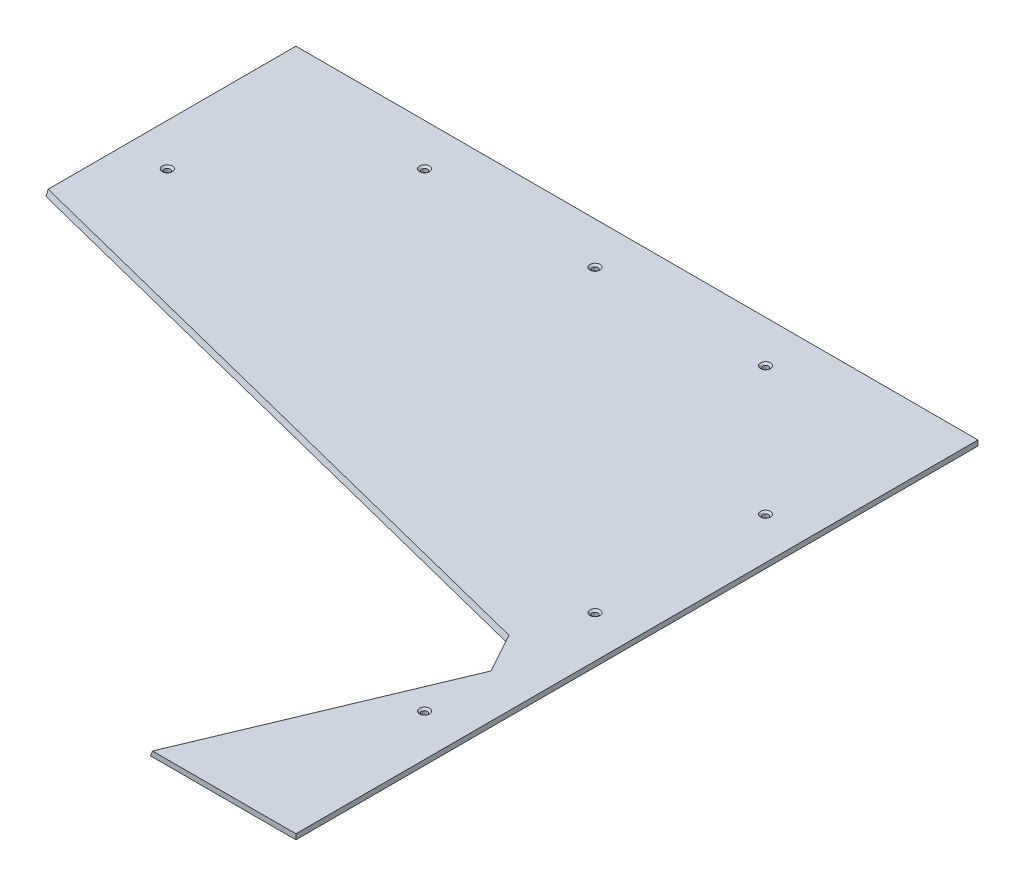
ISO-10303-21;
HEADER;
FILE_DESCRIPTION(('STEP AP214'),'2;1');
FILE_NAME('part.step','',(''),(''),'','','');
FILE_SCHEMA(('AUTOMOTIVE_DESIGN { 1 0 10303 214 1 1 1 1 }'));
ENDSEC;
DATA;
#1=APPLICATION_CONTEXT('core data for automotive mechanical design processes');
#2=APPLICATION_PROTOCOL_DEFINITION('international standard','automotive_design',2000,#1);
#3=PRODUCT_CONTEXT('',#1,'mechanical');
#4=PRODUCT('Part','Part','',(#3));
#5=PRODUCT_RELATED_PRODUCT_CATEGORY('part','',(#4));
#6=PRODUCT_DEFINITION_FORMATION('','',#4);
#7=PRODUCT_DEFINITION_CONTEXT('part definition',#1,'design');
#8=PRODUCT_DEFINITION('design','',#6,#7);
#9=PRODUCT_DEFINITION_SHAPE('','',#8);
#10=(LENGTH_UNIT() NAMED_UNIT(*) SI_UNIT(.MILLI.,.METRE.));
#11=(NAMED_UNIT(*) PLANE_ANGLE_UNIT() SI_UNIT($,.RADIAN.));
#12=(NAMED_UNIT(*) SI_UNIT($,.STERADIAN.) SOLID_ANGLE_UNIT());
#13=UNCERTAINTY_MEASURE_WITH_UNIT(LENGTH_MEASURE(1.E-05),#10,'distance_accuracy_value','');
#14=(GEOMETRIC_REPRESENTATION_CONTEXT(3) GLOBAL_UNCERTAINTY_ASSIGNED_CONTEXT((#13)) GLOBAL_UNIT_ASSIGNED_CONTEXT((#10,
#11,#12)) REPRESENTATION_CONTEXT('',''));
#15=CARTESIAN_POINT('',(0.,0.,0.));
#16=DIRECTION('',(0.,0.,1.));
#17=DIRECTION('',(1.,0.,0.));
#18=AXIS2_PLACEMENT_3D('',#15,#16,#17);
#19=CARTESIAN_POINT('',(103.375714,114.488214,103.375714));
#20=DIRECTION('',(1.,0.,0.));
#21=DIRECTION('',(0.,0.,1.));
#22=AXIS2_PLACEMENT_3D('',#19,#20,#21);
#23=PLANE('',#22);
#24=DIRECTION('',(0.,0.,1.));
#25=VECTOR('',#24,1.);
#26=CARTESIAN_POINT('',(103.375714,112.900714,103.375714));
#27=LINE('',#26,#25);
#28=CARTESIAN_POINT('',(103.375714,112.900714,-103.375714));
#29=VERTEX_POINT('',#28);
#30=CARTESIAN_POINT('',(103.375714,112.900714,103.375714));
#31=VERTEX_POINT('',#30);
#32=EDGE_CURVE('E188',#29,#31,#27,.T.);
#33=ORIENTED_EDGE('',*,*,#32,.F.);
#34=DIRECTION('',(0.,-1.,0.));
#35=VECTOR('',#34,1.);
#36=CARTESIAN_POINT('',(103.375714,114.488214,-103.375714));
#37=LINE('',#36,#35);
#38=CARTESIAN_POINT('',(103.375714,114.488214,-103.375714));
#39=VERTEX_POINT('',#38);
#40=EDGE_CURVE('E55',#39,#29,#37,.T.);
#41=ORIENTED_EDGE('',*,*,#40,.F.);
#42=DIRECTION('',(0.,0.,1.));
#43=VECTOR('',#42,1.);
#44=CARTESIAN_POINT('',(103.375714,114.488214,103.375714));
#45=LINE('',#44,#43);
#46=CARTESIAN_POINT('',(103.375714,114.488214,103.375714));
#47=VERTEX_POINT('',#46);
#48=EDGE_CURVE('E189',#39,#47,#45,.T.);
#49=ORIENTED_EDGE('',*,*,#48,.T.);
#50=DIRECTION('',(0.,-1.,0.));
#51=VECTOR('',#50,1.);
#52=CARTESIAN_POINT('',(103.375714,114.488214,103.375714));
#53=LINE('',#52,#51);
#54=EDGE_CURVE('E76',#47,#31,#53,.T.);
#55=ORIENTED_EDGE('',*,*,#54,.T.);
#56=EDGE_LOOP('',(#33,#41,#49,#55));
#57=FACE_BOUND('',#56,.T.);
#58=ADVANCED_FACE('F32',(#57),#23,.T.);
#59=CARTESIAN_POINT('',(103.375714,114.488214,-103.375714));
#60=DIRECTION('',(0.,0.,-1.));
#61=DIRECTION('',(1.,0.,0.));
#62=AXIS2_PLACEMENT_3D('',#59,#60,#61);
#63=PLANE('',#62);
#64=DIRECTION('',(1.,0.,0.));
#65=VECTOR('',#64,1.);
#66=CARTESIAN_POINT('',(103.375714,112.900714,-103.375714));
#67=LINE('',#66,#65);
#68=CARTESIAN_POINT('',(-103.375714,112.900714,-103.375714));
#69=VERTEX_POINT('',#68);
#70=EDGE_CURVE('E192',#69,#29,#67,.T.);
#71=ORIENTED_EDGE('',*,*,#70,.F.);
#72=DIRECTION('',(0.,-1.,0.));
#73=VECTOR('',#72,1.);
#74=CARTESIAN_POINT('',(-103.375714,114.488214,-103.375714));
#75=LINE('',#74,#73);
#76=CARTESIAN_POINT('',(-103.375714,114.488214,-103.375714));
#77=VERTEX_POINT('',#76);
#78=EDGE_CURVE('E208',#77,#69,#75,.T.);
#79=ORIENTED_EDGE('',*,*,#78,.F.);
#80=DIRECTION('',(1.,0.,0.));
#81=VECTOR('',#80,1.);
#82=CARTESIAN_POINT('',(103.375714,114.488214,-103.375714));
#83=LINE('',#82,#81);
#84=EDGE_CURVE('E196',#77,#39,#83,.T.);
#85=ORIENTED_EDGE('',*,*,#84,.T.);
#86=ORIENTED_EDGE('',*,*,#40,.T.);
#87=EDGE_LOOP('',(#71,#79,#85,#86));
#88=FACE_BOUND('',#87,.T.);
#89=ADVANCED_FACE('F223',(#88),#63,.T.);
#90=CARTESIAN_POINT('',(-103.375714,114.488214,103.375714));
#91=DIRECTION('',(-1.,0.,0.));
#92=DIRECTION('',(0.,0.,-1.));
#93=AXIS2_PLACEMENT_3D('',#90,#91,#92);
#94=PLANE('',#93);
#95=DIRECTION('',(0.,-0.923214701144147,0.384284550289657));
#96=VECTOR('',#95,1.);
#97=CARTESIAN_POINT('',(-103.375714,67.7777488921293,-8.84266181646749));
#98=LINE('',#97,#96);
#99=CARTESIAN_POINT('',(-103.375714,114.488214,-28.285712339334));
#100=VERTEX_POINT('',#99);
#101=CARTESIAN_POINT('',(-103.375714,112.900714,-27.6249216014604));
#102=VERTEX_POINT('',#101);
#103=EDGE_CURVE('E119',#100,#102,#98,.T.);
#104=ORIENTED_EDGE('',*,*,#103,.F.);
#105=DIRECTION('',(0.,0.,-1.));
#106=VECTOR('',#105,1.);
#107=CARTESIAN_POINT('',(-103.375714,114.488214,103.375714));
#108=LINE('',#107,#106);
#109=EDGE_CURVE('E194',#100,#77,#108,.T.);
#110=ORIENTED_EDGE('',*,*,#109,.T.);
#111=ORIENTED_EDGE('',*,*,#78,.T.);
#112=DIRECTION('',(0.,0.,-1.));
#113=VECTOR('',#112,1.);
#114=CARTESIAN_POINT('',(-103.375714,112.900714,103.375714));
#115=LINE('',#114,#113);
#116=EDGE_CURVE('E203',#102,#69,#115,.T.);
#117=ORIENTED_EDGE('',*,*,#116,.F.);
#118=EDGE_LOOP('',(#104,#110,#111,#117));
#119=FACE_BOUND('',#118,.T.);
#120=ADVANCED_FACE('F220',(#119),#94,.T.);
#121=CARTESIAN_POINT('',(103.375714,114.488214,103.375714));
#122=DIRECTION('',(0.,0.,1.));
#123=DIRECTION('',(-1.,0.,0.));
#124=AXIS2_PLACEMENT_3D('',#121,#122,#123);
#125=PLANE('',#124);
#126=DIRECTION('',(0.370324166908682,0.928902584452961,0.));
#127=VECTOR('',#126,1.);
#128=CARTESIAN_POINT('',(65.8820392216929,129.435759748081,103.375714));
#129=LINE('',#128,#127);
#130=CARTESIAN_POINT('',(59.2900379247417,112.900714,103.375714));
#131=VERTEX_POINT('',#130);
#132=CARTESIAN_POINT('',(59.9229241119556,114.488214,103.375714));
#133=VERTEX_POINT('',#132);
#134=EDGE_CURVE('E104',#131,#133,#129,.T.);
#135=ORIENTED_EDGE('',*,*,#134,.F.);
#136=DIRECTION('',(-1.,0.,0.));
#137=VECTOR('',#136,1.);
#138=CARTESIAN_POINT('',(103.375714,112.900714,103.375714));
#139=LINE('',#138,#137);
#140=EDGE_CURVE('E200',#31,#131,#139,.T.);
#141=ORIENTED_EDGE('',*,*,#140,.F.);
#142=ORIENTED_EDGE('',*,*,#54,.F.);
#143=DIRECTION('',(-1.,0.,0.));
#144=VECTOR('',#143,1.);
#145=CARTESIAN_POINT('',(103.375714,114.488214,103.375714));
#146=LINE('',#145,#144);
#147=EDGE_CURVE('E191',#47,#133,#146,.T.);
#148=ORIENTED_EDGE('',*,*,#147,.T.);
#149=EDGE_LOOP('',(#135,#141,#142,#148));
#150=FACE_BOUND('',#149,.T.);
#151=ADVANCED_FACE('F224',(#150),#125,.T.);
#152=CARTESIAN_POINT('',(103.375714,114.488214,-103.375714));
#153=DIRECTION('',(0.,1.,0.));
#154=DIRECTION('',(0.,0.,-1.));
#155=AXIS2_PLACEMENT_3D('',#152,#153,#154);
#156=PLANE('',#155);
#157=DIRECTION('',(0.386214206739788,0.,-0.922409121004533));
#158=VECTOR('',#157,1.);
#159=CARTESIAN_POINT('',(140.059084456709,114.488214,-88.0163268269303));
#160=LINE('',#159,#158);
#161=CARTESIAN_POINT('',(90.2021731605812,114.488214,31.0587069810483));
#162=VERTEX_POINT('',#161);
#163=EDGE_CURVE('E99',#133,#162,#160,.T.);
#164=ORIENTED_EDGE('',*,*,#163,.F.);
#165=ORIENTED_EDGE('',*,*,#147,.F.);
#166=ORIENTED_EDGE('',*,*,#48,.F.);
#167=ORIENTED_EDGE('',*,*,#84,.F.);
#168=ORIENTED_EDGE('',*,*,#109,.F.);
#169=DIRECTION('',(-0.969510212842494,0.,-0.245050907352128));
#170=VECTOR('',#169,1.);
#171=CARTESIAN_POINT('',(73.1204673287784,114.488214,16.3250084203753));
#172=LINE('',#171,#170);
#173=CARTESIAN_POINT('',(83.5395341980309,114.488214,18.9585049594031));
#174=VERTEX_POINT('',#173);
#175=EDGE_CURVE('E118',#174,#100,#172,.T.);
#176=ORIENTED_EDGE('',*,*,#175,.F.);
#177=DIRECTION('',(-0.482337100584352,0.,-0.875985685613573));
#178=VECTOR('',#177,1.);
#179=CARTESIAN_POINT('',(36.4657005431364,114.488214,-66.533580137689));
#180=LINE('',#179,#178);
#181=EDGE_CURVE('E110',#162,#174,#180,.T.);
#182=ORIENTED_EDGE('',*,*,#181,.F.);
#183=EDGE_LOOP('',(#164,#165,#166,#167,#168,#176,#182));
#184=FACE_BOUND('',#183,.T.);
#185=CARTESIAN_POINT('',(-90.6757139999995,114.488214,-51.687857000001));
#186=DIRECTION('',(0.,1.,0.));
#187=DIRECTION('',(0.,0.,-1.));
#188=AXIS2_PLACEMENT_3D('',#185,#186,#187);
#189=CIRCLE('',#188,1.51129999999999);
#190=CARTESIAN_POINT('',(-90.6757139999995,114.488214,-53.1991570000009));
#191=VERTEX_POINT('',#190);
#192=EDGE_CURVE('E107',#191,#191,#189,.T.);
#193=ORIENTED_EDGE('',*,*,#192,.F.);
#194=EDGE_LOOP('',(#193));
#195=FACE_BOUND('',#194,.T.);
#196=CARTESIAN_POINT('',(90.6757140000002,114.488214,-51.6878569999997));
#197=DIRECTION('',(0.,1.,0.));
#198=DIRECTION('',(0.,0.,-1.));
#199=AXIS2_PLACEMENT_3D('',#196,#197,#198);
#200=CIRCLE('',#199,1.51130000000001);
#201=CARTESIAN_POINT('',(90.6757140000002,114.488214,-53.1991569999997));
#202=VERTEX_POINT('',#201);
#203=EDGE_CURVE('E134',#202,#202,#200,.T.);
#204=ORIENTED_EDGE('',*,*,#203,.F.);
#205=EDGE_LOOP('',(#204));
#206=FACE_BOUND('',#205,.T.);
#207=CARTESIAN_POINT('',(90.675714,114.488214,3.03005275632947E-13));
#208=DIRECTION('',(0.,1.,0.));
#209=DIRECTION('',(0.,0.,-1.));
#210=AXIS2_PLACEMENT_3D('',#207,#208,#209);
#211=CIRCLE('',#210,1.51129999999999);
#212=CARTESIAN_POINT('',(90.675714,114.488214,-1.51129999999969));
#213=VERTEX_POINT('',#212);
#214=EDGE_CURVE('E143',#213,#213,#211,.T.);
#215=ORIENTED_EDGE('',*,*,#214,.F.);
#216=EDGE_LOOP('',(#215));
#217=FACE_BOUND('',#216,.T.);
#218=CARTESIAN_POINT('',(90.6757139999998,114.488214,51.6878570000003));
#219=DIRECTION('',(0.,1.,0.));
#220=DIRECTION('',(0.,0.,-1.));
#221=AXIS2_PLACEMENT_3D('',#218,#219,#220);
#222=CIRCLE('',#221,1.51129999999999);
#223=CARTESIAN_POINT('',(90.6757139999998,114.488214,50.1765570000003));
#224=VERTEX_POINT('',#223);
#225=EDGE_CURVE('E152',#224,#224,#222,.T.);
#226=ORIENTED_EDGE('',*,*,#225,.F.);
#227=EDGE_LOOP('',(#226));
#228=FACE_BOUND('',#227,.T.);
#229=CARTESIAN_POINT('',(-51.687857,114.488214,-90.675714));
#230=DIRECTION('',(0.,1.,0.));
#231=DIRECTION('',(0.,0.,-1.));
#232=AXIS2_PLACEMENT_3D('',#229,#230,#231);
#233=CIRCLE('',#232,1.5113);
#234=CARTESIAN_POINT('',(-51.687857,114.488214,-92.187014));
#235=VERTEX_POINT('',#234);
#236=EDGE_CURVE('E161',#235,#235,#233,.T.);
#237=ORIENTED_EDGE('',*,*,#236,.F.);
#238=EDGE_LOOP('',(#237));
#239=FACE_BOUND('',#238,.T.);
#240=CARTESIAN_POINT('',(0.,114.488214,-90.675714));
#241=DIRECTION('',(0.,1.,0.));
#242=DIRECTION('',(0.,0.,-1.));
#243=AXIS2_PLACEMENT_3D('',#240,#241,#242);
#244=CIRCLE('',#243,1.5113);
#245=CARTESIAN_POINT('',(0.,114.488214,-92.187014));
#246=VERTEX_POINT('',#245);
#247=EDGE_CURVE('E170',#246,#246,#244,.T.);
#248=ORIENTED_EDGE('',*,*,#247,.F.);
#249=EDGE_LOOP('',(#248));
#250=FACE_BOUND('',#249,.T.);
#251=CARTESIAN_POINT('',(51.687857,114.488214,-90.675714));
#252=DIRECTION('',(0.,1.,0.));
#253=DIRECTION('',(0.,0.,-1.));
#254=AXIS2_PLACEMENT_3D('',#251,#252,#253);
#255=CIRCLE('',#254,1.5113);
#256=CARTESIAN_POINT('',(51.687857,114.488214,-92.187014));
#257=VERTEX_POINT('',#256);
#258=EDGE_CURVE('E179',#257,#257,#255,.T.);
#259=ORIENTED_EDGE('',*,*,#258,.F.);
#260=EDGE_LOOP('',(#259));
#261=FACE_BOUND('',#260,.T.);
#262=ADVANCED_FACE('F115',(#184,#195,#206,#217,#228,#239,#250,#261),#156,.T.);
#263=CARTESIAN_POINT('',(103.375714,112.900714,-103.375714));
#264=DIRECTION('',(0.,1.,0.));
#265=DIRECTION('',(0.,0.,-1.));
#266=AXIS2_PLACEMENT_3D('',#263,#264,#265);
#267=PLANE('',#266);
#268=ORIENTED_EDGE('',*,*,#140,.T.);
#269=DIRECTION('',(0.386214206739788,0.,-0.922409121004533));
#270=VECTOR('',#269,1.);
#271=CARTESIAN_POINT('',(139.520600467756,112.900714,-88.2417909533136));
#272=LINE('',#271,#270);
#273=CARTESIAN_POINT('',(91.1661518821163,112.900714,27.2448577462518));
#274=VERTEX_POINT('',#273);
#275=EDGE_CURVE('E11',#131,#274,#272,.T.);
#276=ORIENTED_EDGE('',*,*,#275,.T.);
#277=DIRECTION('',(-0.482337100584352,0.,-0.875985685613573));
#278=VECTOR('',#277,1.);
#279=CARTESIAN_POINT('',(38.8168395913419,112.900714,-67.8281693190039));
#280=LINE('',#279,#278);
#281=CARTESIAN_POINT('',(87.521539653221,112.900714,20.6257771524999));
#282=VERTEX_POINT('',#281);
#283=EDGE_CURVE('E112',#274,#282,#280,.T.);
#284=ORIENTED_EDGE('',*,*,#283,.T.);
#285=DIRECTION('',(-0.969510212842494,0.,-0.245050907352128));
#286=VECTOR('',#285,1.);
#287=CARTESIAN_POINT('',(72.9634770899354,112.900714,16.9461187093333));
#288=LINE('',#287,#286);
#289=EDGE_CURVE('E39',#282,#102,#288,.T.);
#290=ORIENTED_EDGE('',*,*,#289,.T.);
#291=ORIENTED_EDGE('',*,*,#116,.T.);
#292=ORIENTED_EDGE('',*,*,#70,.T.);
#293=ORIENTED_EDGE('',*,*,#32,.T.);
#294=EDGE_LOOP('',(#268,#276,#284,#290,#291,#292,#293));
#295=FACE_BOUND('',#294,.T.);
#296=CARTESIAN_POINT('',(-90.6757139999995,112.900714,-51.687857000001));
#297=DIRECTION('',(0.,1.,0.));
#298=DIRECTION('',(0.,0.,-1.));
#299=AXIS2_PLACEMENT_3D('',#296,#297,#298);
#300=CIRCLE('',#299,0.889000000000001);
#301=CARTESIAN_POINT('',(-90.6757139999995,112.900714,-52.576857000001));
#302=VERTEX_POINT('',#301);
#303=EDGE_CURVE('E131',#302,#302,#300,.T.);
#304=ORIENTED_EDGE('',*,*,#303,.T.);
#305=EDGE_LOOP('',(#304));
#306=FACE_BOUND('',#305,.T.);
#307=CARTESIAN_POINT('',(90.6757140000002,112.900714,-51.6878569999997));
#308=DIRECTION('',(0.,1.,0.));
#309=DIRECTION('',(0.,0.,-1.));
#310=AXIS2_PLACEMENT_3D('',#307,#308,#309);
#311=CIRCLE('',#310,0.889000000000001);
#312=CARTESIAN_POINT('',(90.6757140000002,112.900714,-52.5768569999997));
#313=VERTEX_POINT('',#312);
#314=EDGE_CURVE('E140',#313,#313,#311,.T.);
#315=ORIENTED_EDGE('',*,*,#314,.T.);
#316=EDGE_LOOP('',(#315));
#317=FACE_BOUND('',#316,.T.);
#318=CARTESIAN_POINT('',(90.675714,112.900714,3.03005275632947E-13));
#319=DIRECTION('',(0.,1.,0.));
#320=DIRECTION('',(0.,0.,-1.));
#321=AXIS2_PLACEMENT_3D('',#318,#319,#320);
#322=CIRCLE('',#321,0.889000000000001);
#323=CARTESIAN_POINT('',(90.675714,112.900714,-0.888999999999698));
#324=VERTEX_POINT('',#323);
#325=EDGE_CURVE('E149',#324,#324,#322,.T.);
#326=ORIENTED_EDGE('',*,*,#325,.T.);
#327=EDGE_LOOP('',(#326));
#328=FACE_BOUND('',#327,.T.);
#329=CARTESIAN_POINT('',(90.6757139999998,112.900714,51.6878570000003));
#330=DIRECTION('',(0.,1.,0.));
#331=DIRECTION('',(0.,0.,-1.));
#332=AXIS2_PLACEMENT_3D('',#329,#330,#331);
#333=CIRCLE('',#332,0.889000000000001);
#334=CARTESIAN_POINT('',(90.6757139999998,112.900714,50.7988570000003));
#335=VERTEX_POINT('',#334);
#336=EDGE_CURVE('E158',#335,#335,#333,.T.);
#337=ORIENTED_EDGE('',*,*,#336,.T.);
#338=EDGE_LOOP('',(#337));
#339=FACE_BOUND('',#338,.T.);
#340=CARTESIAN_POINT('',(-51.687857,112.900714,-90.675714));
#341=DIRECTION('',(0.,1.,0.));
#342=DIRECTION('',(0.,0.,-1.));
#343=AXIS2_PLACEMENT_3D('',#340,#341,#342);
#344=CIRCLE('',#343,0.889000000000001);
#345=CARTESIAN_POINT('',(-51.687857,112.900714,-91.564714));
#346=VERTEX_POINT('',#345);
#347=EDGE_CURVE('E167',#346,#346,#344,.T.);
#348=ORIENTED_EDGE('',*,*,#347,.T.);
#349=EDGE_LOOP('',(#348));
#350=FACE_BOUND('',#349,.T.);
#351=CARTESIAN_POINT('',(0.,112.900714,-90.675714));
#352=DIRECTION('',(0.,1.,0.));
#353=DIRECTION('',(0.,0.,-1.));
#354=AXIS2_PLACEMENT_3D('',#351,#352,#353);
#355=CIRCLE('',#354,0.889);
#356=CARTESIAN_POINT('',(0.,112.900714,-91.564714));
#357=VERTEX_POINT('',#356);
#358=EDGE_CURVE('E176',#357,#357,#355,.T.);
#359=ORIENTED_EDGE('',*,*,#358,.T.);
#360=EDGE_LOOP('',(#359));
#361=FACE_BOUND('',#360,.T.);
#362=CARTESIAN_POINT('',(51.687857,112.900714,-90.675714));
#363=DIRECTION('',(0.,1.,0.));
#364=DIRECTION('',(0.,0.,-1.));
#365=AXIS2_PLACEMENT_3D('',#362,#363,#364);
#366=CIRCLE('',#365,0.889000000000001);
#367=CARTESIAN_POINT('',(51.687857,112.900714,-91.564714));
#368=VERTEX_POINT('',#367);
#369=EDGE_CURVE('E185',#368,#368,#366,.T.);
#370=ORIENTED_EDGE('',*,*,#369,.T.);
#371=EDGE_LOOP('',(#370));
#372=FACE_BOUND('',#371,.T.);
#373=ADVANCED_FACE('F215',(#295,#306,#317,#328,#339,#350,#361,#372),#267,.F.);
#374=CARTESIAN_POINT('',(51.687857,114.488214,-90.675714));
#375=DIRECTION('',(0.,1.,0.));
#376=DIRECTION('',(0.,0.,-1.));
#377=AXIS2_PLACEMENT_3D('',#374,#375,#376);
#378=CYLINDRICAL_SURFACE('',#377,0.888999999999997);
#379=ORIENTED_EDGE('',*,*,#369,.F.);
#380=EDGE_LOOP('',(#379));
#381=FACE_BOUND('',#380,.T.);
#382=CARTESIAN_POINT('',(51.687857,113.966042299518,-90.675714));
#383=DIRECTION('',(0.,1.,0.));
#384=DIRECTION('',(0.,0.,-1.));
#385=AXIS2_PLACEMENT_3D('',#382,#383,#384);
#386=CIRCLE('',#385,0.888999999999994);
#387=CARTESIAN_POINT('',(51.687857,113.966042299518,-91.564714));
#388=VERTEX_POINT('',#387);
#389=EDGE_CURVE('E182',#388,#388,#386,.T.);
#390=ORIENTED_EDGE('',*,*,#389,.T.);
#391=EDGE_LOOP('',(#390));
#392=FACE_BOUND('',#391,.T.);
#393=ADVANCED_FACE('F241',(#381,#392),#378,.F.);
#394=CARTESIAN_POINT('',(51.687857,114.488214,-90.675714));
#395=DIRECTION('',(0.,1.,0.));
#396=DIRECTION('',(0.,0.,-1.));
#397=AXIS2_PLACEMENT_3D('',#394,#395,#396);
#398=CONICAL_SURFACE('',#397,1.5113,0.872664625997172);
#399=ORIENTED_EDGE('',*,*,#389,.F.);
#400=EDGE_LOOP('',(#399));
#401=FACE_BOUND('',#400,.T.);
#402=ORIENTED_EDGE('',*,*,#258,.T.);
#403=EDGE_LOOP('',(#402));
#404=FACE_BOUND('',#403,.T.);
#405=ADVANCED_FACE('F245',(#401,#404),#398,.F.);
#406=CARTESIAN_POINT('',(0.,114.488214,-90.675714));
#407=DIRECTION('',(0.,1.,0.));
#408=DIRECTION('',(0.,0.,-1.));
#409=AXIS2_PLACEMENT_3D('',#406,#407,#408);
#410=CYLINDRICAL_SURFACE('',#409,0.888999999999998);
#411=ORIENTED_EDGE('',*,*,#358,.F.);
#412=EDGE_LOOP('',(#411));
#413=FACE_BOUND('',#412,.T.);
#414=CARTESIAN_POINT('',(0.,113.966042299518,-90.675714));
#415=DIRECTION('',(0.,1.,0.));
#416=DIRECTION('',(0.,0.,-1.));
#417=AXIS2_PLACEMENT_3D('',#414,#415,#416);
#418=CIRCLE('',#417,0.888999999999997);
#419=CARTESIAN_POINT('',(0.,113.966042299518,-91.564714));
#420=VERTEX_POINT('',#419);
#421=EDGE_CURVE('E173',#420,#420,#418,.T.);
#422=ORIENTED_EDGE('',*,*,#421,.T.);
#423=EDGE_LOOP('',(#422));
#424=FACE_BOUND('',#423,.T.);
#425=ADVANCED_FACE('F249',(#413,#424),#410,.F.);
#426=CARTESIAN_POINT('',(0.,114.488214,-90.675714));
#427=DIRECTION('',(0.,1.,0.));
#428=DIRECTION('',(0.,0.,-1.));
#429=AXIS2_PLACEMENT_3D('',#426,#427,#428);
#430=CONICAL_SURFACE('',#429,1.5113,0.87266462599717);
#431=ORIENTED_EDGE('',*,*,#421,.F.);
#432=EDGE_LOOP('',(#431));
#433=FACE_BOUND('',#432,.T.);
#434=ORIENTED_EDGE('',*,*,#247,.T.);
#435=EDGE_LOOP('',(#434));
#436=FACE_BOUND('',#435,.T.);
#437=ADVANCED_FACE('F253',(#433,#436),#430,.F.);
#438=CARTESIAN_POINT('',(-51.687857,114.488214,-90.675714));
#439=DIRECTION('',(0.,1.,0.));
#440=DIRECTION('',(0.,0.,-1.));
#441=AXIS2_PLACEMENT_3D('',#438,#439,#440);
#442=CYLINDRICAL_SURFACE('',#441,0.888999999999997);
#443=ORIENTED_EDGE('',*,*,#347,.F.);
#444=EDGE_LOOP('',(#443));
#445=FACE_BOUND('',#444,.T.);
#446=CARTESIAN_POINT('',(-51.687857,113.966042299518,-90.675714));
#447=DIRECTION('',(0.,1.,0.));
#448=DIRECTION('',(0.,0.,-1.));
#449=AXIS2_PLACEMENT_3D('',#446,#447,#448);
#450=CIRCLE('',#449,0.888999999999994);
#451=CARTESIAN_POINT('',(-51.687857,113.966042299518,-91.564714));
#452=VERTEX_POINT('',#451);
#453=EDGE_CURVE('E164',#452,#452,#450,.T.);
#454=ORIENTED_EDGE('',*,*,#453,.T.);
#455=EDGE_LOOP('',(#454));
#456=FACE_BOUND('',#455,.T.);
#457=ADVANCED_FACE('F257',(#445,#456),#442,.F.);
#458=CARTESIAN_POINT('',(-51.687857,114.488214,-90.675714));
#459=DIRECTION('',(0.,1.,0.));
#460=DIRECTION('',(0.,0.,-1.));
#461=AXIS2_PLACEMENT_3D('',#458,#459,#460);
#462=CONICAL_SURFACE('',#461,1.5113,0.872664625997172);
#463=ORIENTED_EDGE('',*,*,#453,.F.);
#464=EDGE_LOOP('',(#463));
#465=FACE_BOUND('',#464,.T.);
#466=ORIENTED_EDGE('',*,*,#236,.T.);
#467=EDGE_LOOP('',(#466));
#468=FACE_BOUND('',#467,.T.);
#469=ADVANCED_FACE('F261',(#465,#468),#462,.F.);
#470=CARTESIAN_POINT('',(90.6757139999998,114.488214,51.6878570000003));
#471=DIRECTION('',(0.,1.,0.));
#472=DIRECTION('',(0.,0.,-1.));
#473=AXIS2_PLACEMENT_3D('',#470,#471,#472);
#474=CYLINDRICAL_SURFACE('',#473,0.889000000000001);
#475=ORIENTED_EDGE('',*,*,#336,.F.);
#476=EDGE_LOOP('',(#475));
#477=FACE_BOUND('',#476,.T.);
#478=CARTESIAN_POINT('',(90.6757139999998,113.966042299518,51.6878570000003));
#479=DIRECTION('',(0.,1.,0.));
#480=DIRECTION('',(0.,0.,-1.));
#481=AXIS2_PLACEMENT_3D('',#478,#479,#480);
#482=CIRCLE('',#481,0.889000000000001);
#483=CARTESIAN_POINT('',(90.6757139999998,113.966042299518,50.7988570000003));
#484=VERTEX_POINT('',#483);
#485=EDGE_CURVE('E155',#484,#484,#482,.T.);
#486=ORIENTED_EDGE('',*,*,#485,.T.);
#487=EDGE_LOOP('',(#486));
#488=FACE_BOUND('',#487,.T.);
#489=ADVANCED_FACE('F265',(#477,#488),#474,.F.);
#490=CARTESIAN_POINT('',(90.6757139999998,114.488214,51.6878570000003));
#491=DIRECTION('',(0.,1.,0.));
#492=DIRECTION('',(0.,0.,-1.));
#493=AXIS2_PLACEMENT_3D('',#490,#491,#492);
#494=CONICAL_SURFACE('',#493,1.51129999999999,0.872664625997161);
#495=ORIENTED_EDGE('',*,*,#485,.F.);
#496=EDGE_LOOP('',(#495));
#497=FACE_BOUND('',#496,.T.);
#498=ORIENTED_EDGE('',*,*,#225,.T.);
#499=EDGE_LOOP('',(#498));
#500=FACE_BOUND('',#499,.T.);
#501=ADVANCED_FACE('F269',(#497,#500),#494,.F.);
#502=CARTESIAN_POINT('',(90.675714,114.488214,3.03005275632947E-13));
#503=DIRECTION('',(0.,1.,0.));
#504=DIRECTION('',(0.,0.,-1.));
#505=AXIS2_PLACEMENT_3D('',#502,#503,#504);
#506=CYLINDRICAL_SURFACE('',#505,0.889000000000001);
#507=ORIENTED_EDGE('',*,*,#325,.F.);
#508=EDGE_LOOP('',(#507));
#509=FACE_BOUND('',#508,.T.);
#510=CARTESIAN_POINT('',(90.675714,113.966042299518,3.03005275632947E-13));
#511=DIRECTION('',(0.,1.,0.));
#512=DIRECTION('',(0.,0.,-1.));
#513=AXIS2_PLACEMENT_3D('',#510,#511,#512);
#514=CIRCLE('',#513,0.889000000000001);
#515=CARTESIAN_POINT('',(90.675714,113.966042299518,-0.888999999999698));
#516=VERTEX_POINT('',#515);
#517=EDGE_CURVE('E146',#516,#516,#514,.T.);
#518=ORIENTED_EDGE('',*,*,#517,.T.);
#519=EDGE_LOOP('',(#518));
#520=FACE_BOUND('',#519,.T.);
#521=ADVANCED_FACE('F273',(#509,#520),#506,.F.);
#522=CARTESIAN_POINT('',(90.675714,114.488214,3.03005275632947E-13));
#523=DIRECTION('',(0.,1.,0.));
#524=DIRECTION('',(0.,0.,-1.));
#525=AXIS2_PLACEMENT_3D('',#522,#523,#524);
#526=CONICAL_SURFACE('',#525,1.51129999999999,0.872664625997161);
#527=ORIENTED_EDGE('',*,*,#517,.F.);
#528=EDGE_LOOP('',(#527));
#529=FACE_BOUND('',#528,.T.);
#530=ORIENTED_EDGE('',*,*,#214,.T.);
#531=EDGE_LOOP('',(#530));
#532=FACE_BOUND('',#531,.T.);
#533=ADVANCED_FACE('F277',(#529,#532),#526,.F.);
#534=CARTESIAN_POINT('',(90.6757140000002,114.488214,-51.6878569999997));
#535=DIRECTION('',(0.,1.,0.));
#536=DIRECTION('',(0.,0.,-1.));
#537=AXIS2_PLACEMENT_3D('',#534,#535,#536);
#538=CYLINDRICAL_SURFACE('',#537,0.889000000000001);
#539=ORIENTED_EDGE('',*,*,#314,.F.);
#540=EDGE_LOOP('',(#539));
#541=FACE_BOUND('',#540,.T.);
#542=CARTESIAN_POINT('',(90.6757140000002,113.966042299518,-51.6878569999997));
#543=DIRECTION('',(0.,1.,0.));
#544=DIRECTION('',(0.,0.,-1.));
#545=AXIS2_PLACEMENT_3D('',#542,#543,#544);
#546=CIRCLE('',#545,0.889000000000001);
#547=CARTESIAN_POINT('',(90.6757140000002,113.966042299518,-52.5768569999997));
#548=VERTEX_POINT('',#547);
#549=EDGE_CURVE('E137',#548,#548,#546,.T.);
#550=ORIENTED_EDGE('',*,*,#549,.T.);
#551=EDGE_LOOP('',(#550));
#552=FACE_BOUND('',#551,.T.);
#553=ADVANCED_FACE('F281',(#541,#552),#538,.F.);
#554=CARTESIAN_POINT('',(90.6757140000002,114.488214,-51.6878569999997));
#555=DIRECTION('',(0.,1.,0.));
#556=DIRECTION('',(0.,0.,-1.));
#557=AXIS2_PLACEMENT_3D('',#554,#555,#556);
#558=CONICAL_SURFACE('',#557,1.51130000000001,0.872664625997172);
#559=ORIENTED_EDGE('',*,*,#549,.F.);
#560=EDGE_LOOP('',(#559));
#561=FACE_BOUND('',#560,.T.);
#562=ORIENTED_EDGE('',*,*,#203,.T.);
#563=EDGE_LOOP('',(#562));
#564=FACE_BOUND('',#563,.T.);
#565=ADVANCED_FACE('F285',(#561,#564),#558,.F.);
#566=CARTESIAN_POINT('',(-90.6757139999995,114.488214,-51.687857000001));
#567=DIRECTION('',(0.,1.,0.));
#568=DIRECTION('',(0.,0.,-1.));
#569=AXIS2_PLACEMENT_3D('',#566,#567,#568);
#570=CYLINDRICAL_SURFACE('',#569,0.889000000000001);
#571=ORIENTED_EDGE('',*,*,#303,.F.);
#572=EDGE_LOOP('',(#571));
#573=FACE_BOUND('',#572,.T.);
#574=CARTESIAN_POINT('',(-90.6757139999995,113.966042299518,-51.687857000001));
#575=DIRECTION('',(0.,1.,0.));
#576=DIRECTION('',(0.,0.,-1.));
#577=AXIS2_PLACEMENT_3D('',#574,#575,#576);
#578=CIRCLE('',#577,0.889000000000001);
#579=CARTESIAN_POINT('',(-90.6757139999995,113.966042299518,-52.576857000001));
#580=VERTEX_POINT('',#579);
#581=EDGE_CURVE('E128',#580,#580,#578,.T.);
#582=ORIENTED_EDGE('',*,*,#581,.T.);
#583=EDGE_LOOP('',(#582));
#584=FACE_BOUND('',#583,.T.);
#585=ADVANCED_FACE('F289',(#573,#584),#570,.F.);
#586=CARTESIAN_POINT('',(-90.6757139999995,114.488214,-51.687857000001));
#587=DIRECTION('',(0.,1.,0.));
#588=DIRECTION('',(0.,0.,-1.));
#589=AXIS2_PLACEMENT_3D('',#586,#587,#588);
#590=CONICAL_SURFACE('',#589,1.51129999999999,0.872664625997161);
#591=ORIENTED_EDGE('',*,*,#581,.F.);
#592=EDGE_LOOP('',(#591));
#593=FACE_BOUND('',#592,.T.);
#594=ORIENTED_EDGE('',*,*,#192,.T.);
#595=EDGE_LOOP('',(#594));
#596=FACE_BOUND('',#595,.T.);
#597=ADVANCED_FACE('F293',(#593,#596),#590,.F.);
#598=CARTESIAN_POINT('',(92.3302663671615,110.983626305298,22.6391988879989));
#599=DIRECTION('',(0.445952793407952,0.860715155595185,-0.245551475215283));
#600=DIRECTION('',(-0.887899482968571,0.460037507323201,0.));
#601=AXIS2_PLACEMENT_3D('',#598,#599,#600);
#602=PLANE('',#601);
#603=ORIENTED_EDGE('',*,*,#181,.T.);
#604=DIRECTION('',(-0.865728638508028,0.345138706889568,-0.362481996068263));
#605=VECTOR('',#604,1.);
#606=CARTESIAN_POINT('',(92.3302663671615,110.983626305298,22.6391988879989));
#607=LINE('',#606,#605);
#608=EDGE_CURVE('E46',#282,#174,#607,.T.);
#609=ORIENTED_EDGE('',*,*,#608,.F.);
#610=ORIENTED_EDGE('',*,*,#283,.F.);
#611=DIRECTION('',(0.22724442901572,-0.374230803028497,-0.899061330247256));
#612=VECTOR('',#611,1.);
#613=CARTESIAN_POINT('',(49.1503902818747,182.093135005069,193.474440047923));
#614=LINE('',#613,#612);
#615=EDGE_CURVE('E102',#162,#274,#614,.T.);
#616=ORIENTED_EDGE('',*,*,#615,.F.);
#617=EDGE_LOOP('',(#603,#609,#610,#616));
#618=FACE_BOUND('',#617,.T.);
#619=ADVANCED_FACE('F109',(#618),#602,.F.);
#620=CARTESIAN_POINT('',(-34.8794305366205,19.91063190263,239.743118636919));
#621=DIRECTION('',(0.865728638508029,-0.345138706889568,0.362481996068263));
#622=DIRECTION('',(0.386214206739788,0.,-0.922409121004533));
#623=AXIS2_PLACEMENT_3D('',#620,#621,#622);
#624=PLANE('',#623);
#625=ORIENTED_EDGE('',*,*,#163,.T.);
#626=ORIENTED_EDGE('',*,*,#615,.T.);
#627=ORIENTED_EDGE('',*,*,#275,.F.);
#628=ORIENTED_EDGE('',*,*,#134,.T.);
#629=EDGE_LOOP('',(#625,#626,#627,#628));
#630=FACE_BOUND('',#629,.T.);
#631=ADVANCED_FACE('F101',(#630),#624,.F.);
#632=CARTESIAN_POINT('',(8.30044554866635,-51.1988767971413,68.9078774769947));
#633=DIRECTION('',(0.22724442901572,-0.374230803028497,-0.899061330247256));
#634=DIRECTION('',(0.,0.923214701144147,-0.384284550289657));
#635=AXIS2_PLACEMENT_3D('',#632,#633,#634);
#636=PLANE('',#635);
#637=ORIENTED_EDGE('',*,*,#175,.T.);
#638=ORIENTED_EDGE('',*,*,#103,.T.);
#639=ORIENTED_EDGE('',*,*,#289,.F.);
#640=ORIENTED_EDGE('',*,*,#608,.T.);
#641=EDGE_LOOP('',(#637,#638,#639,#640));
#642=FACE_BOUND('',#641,.T.);
#643=ADVANCED_FACE('F300',(#642),#636,.F.);
#644=CLOSED_SHELL('',(#58,#89,#120,#151,#262,#373,#393,#405,#425,#437,#457,#469,#489,#501,#521,
#533,#553,#565,#585,#597,#619,#631,#643));
#645=MANIFOLD_SOLID_BREP('B2',#644);
#646=ADVANCED_BREP_SHAPE_REPRESENTATION('',(#18,#645),#14);
#647=SHAPE_DEFINITION_REPRESENTATION(#9,#646);
ENDSEC;
END-ISO-10303-21;
